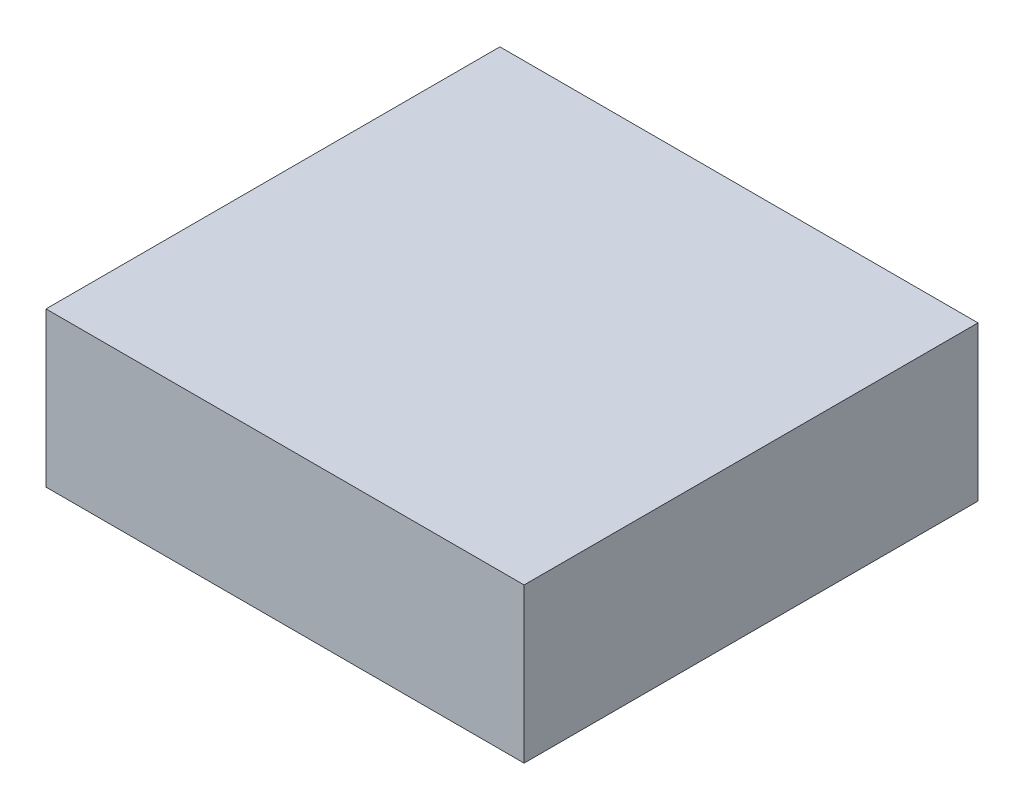
ISO-10303-21;
HEADER;
FILE_DESCRIPTION(('STEP AP214'),'2;1');
FILE_NAME('part.step','',(''),(''),'','','');
FILE_SCHEMA(('AUTOMOTIVE_DESIGN { 1 0 10303 214 1 1 1 1 }'));
ENDSEC;
DATA;
#1=APPLICATION_CONTEXT('core data for automotive mechanical design processes');
#2=APPLICATION_PROTOCOL_DEFINITION('international standard','automotive_design',2000,#1);
#3=PRODUCT_CONTEXT('',#1,'mechanical');
#4=PRODUCT('Part','Part','',(#3));
#5=PRODUCT_RELATED_PRODUCT_CATEGORY('part','',(#4));
#6=PRODUCT_DEFINITION_FORMATION('','',#4);
#7=PRODUCT_DEFINITION_CONTEXT('part definition',#1,'design');
#8=PRODUCT_DEFINITION('design','',#6,#7);
#9=PRODUCT_DEFINITION_SHAPE('','',#8);
#10=(LENGTH_UNIT() NAMED_UNIT(*) SI_UNIT(.MILLI.,.METRE.));
#11=(NAMED_UNIT(*) PLANE_ANGLE_UNIT() SI_UNIT($,.RADIAN.));
#12=(NAMED_UNIT(*) SI_UNIT($,.STERADIAN.) SOLID_ANGLE_UNIT());
#13=UNCERTAINTY_MEASURE_WITH_UNIT(LENGTH_MEASURE(1.E-05),#10,'distance_accuracy_value','');
#14=(GEOMETRIC_REPRESENTATION_CONTEXT(3) GLOBAL_UNCERTAINTY_ASSIGNED_CONTEXT((#13)) GLOBAL_UNIT_ASSIGNED_CONTEXT((#10,
#11,#12)) REPRESENTATION_CONTEXT('',''));
#15=CARTESIAN_POINT('',(0.,0.,0.));
#16=DIRECTION('',(0.,0.,1.));
#17=DIRECTION('',(1.,0.,0.));
#18=AXIS2_PLACEMENT_3D('',#15,#16,#17);
#19=CARTESIAN_POINT('',(50.,30.,50.));
#20=DIRECTION('',(-1.,0.,0.));
#21=DIRECTION('',(0.,0.,1.));
#22=AXIS2_PLACEMENT_3D('',#19,#20,#21);
#23=PLANE('',#22);
#24=DIRECTION('',(0.,0.,-1.));
#25=VECTOR('',#24,1.);
#26=CARTESIAN_POINT('',(50.,30.,50.));
#27=LINE('',#26,#25);
#28=CARTESIAN_POINT('',(50.,30.,38.220378054403));
#29=VERTEX_POINT('',#28);
#30=CARTESIAN_POINT('',(50.,30.,-50.));
#31=VERTEX_POINT('',#30);
#32=EDGE_CURVE('E116',#29,#31,#27,.T.);
#33=ORIENTED_EDGE('',*,*,#32,.F.);
#34=DIRECTION('',(0.,-1.,0.));
#35=VECTOR('',#34,1.);
#36=CARTESIAN_POINT('',(50.,30.,38.220378054403));
#37=LINE('',#36,#35);
#38=CARTESIAN_POINT('',(50.,0.,38.220378054403));
#39=VERTEX_POINT('',#38);
#40=EDGE_CURVE('E135',#29,#39,#37,.T.);
#41=ORIENTED_EDGE('',*,*,#40,.T.);
#42=DIRECTION('',(0.,0.,-1.));
#43=VECTOR('',#42,1.);
#44=CARTESIAN_POINT('',(50.,0.,50.));
#45=LINE('',#44,#43);
#46=CARTESIAN_POINT('',(50.,0.,-50.));
#47=VERTEX_POINT('',#46);
#48=EDGE_CURVE('E121',#39,#47,#45,.T.);
#49=ORIENTED_EDGE('',*,*,#48,.T.);
#50=DIRECTION('',(0.,-1.,0.));
#51=VECTOR('',#50,1.);
#52=CARTESIAN_POINT('',(50.,30.,-50.));
#53=LINE('',#52,#51);
#54=EDGE_CURVE('E11',#31,#47,#53,.T.);
#55=ORIENTED_EDGE('',*,*,#54,.F.);
#56=EDGE_LOOP('',(#33,#41,#49,#55));
#57=FACE_BOUND('',#56,.T.);
#58=ADVANCED_FACE('F35',(#57),#23,.F.);
#59=CARTESIAN_POINT('',(-50.,30.,-50.));
#60=DIRECTION('',(0.,0.,1.));
#61=DIRECTION('',(1.,0.,0.));
#62=AXIS2_PLACEMENT_3D('',#59,#60,#61);
#63=PLANE('',#62);
#64=DIRECTION('',(-1.,0.,0.));
#65=VECTOR('',#64,1.);
#66=CARTESIAN_POINT('',(-50.,0.,-50.));
#67=LINE('',#66,#65);
#68=CARTESIAN_POINT('',(-42.9247651028222,0.,-50.));
#69=VERTEX_POINT('',#68);
#70=EDGE_CURVE('E112',#47,#69,#67,.T.);
#71=ORIENTED_EDGE('',*,*,#70,.T.);
#72=DIRECTION('',(0.,-1.,0.));
#73=VECTOR('',#72,1.);
#74=CARTESIAN_POINT('',(-42.9247651028222,30.,-50.));
#75=LINE('',#74,#73);
#76=CARTESIAN_POINT('',(-42.9247651028222,30.,-50.));
#77=VERTEX_POINT('',#76);
#78=EDGE_CURVE('E100',#77,#69,#75,.T.);
#79=ORIENTED_EDGE('',*,*,#78,.F.);
#80=DIRECTION('',(-1.,0.,0.));
#81=VECTOR('',#80,1.);
#82=CARTESIAN_POINT('',(-50.,30.,-50.));
#83=LINE('',#82,#81);
#84=EDGE_CURVE('E42',#31,#77,#83,.T.);
#85=ORIENTED_EDGE('',*,*,#84,.F.);
#86=ORIENTED_EDGE('',*,*,#54,.T.);
#87=EDGE_LOOP('',(#71,#79,#85,#86));
#88=FACE_BOUND('',#87,.T.);
#89=ADVANCED_FACE('F109',(#88),#63,.F.);
#90=CARTESIAN_POINT('',(0.,30.,0.));
#91=DIRECTION('',(0.,-1.,0.));
#92=DIRECTION('',(0.,0.,-1.));
#93=AXIS2_PLACEMENT_3D('',#90,#91,#92);
#94=PLANE('',#93);
#95=ORIENTED_EDGE('',*,*,#84,.T.);
#96=DIRECTION('',(0.,0.,1.));
#97=VECTOR('',#96,1.);
#98=CARTESIAN_POINT('',(-42.9247651028222,30.,38.220378054403));
#99=LINE('',#98,#97);
#100=CARTESIAN_POINT('',(-42.9247651028222,30.,38.220378054403));
#101=VERTEX_POINT('',#100);
#102=EDGE_CURVE('E97',#77,#101,#99,.T.);
#103=ORIENTED_EDGE('',*,*,#102,.T.);
#104=DIRECTION('',(1.,0.,0.));
#105=VECTOR('',#104,1.);
#106=CARTESIAN_POINT('',(-50.,30.,38.220378054403));
#107=LINE('',#106,#105);
#108=EDGE_CURVE('E199',#101,#29,#107,.T.);
#109=ORIENTED_EDGE('',*,*,#108,.T.);
#110=ORIENTED_EDGE('',*,*,#32,.T.);
#111=EDGE_LOOP('',(#95,#103,#109,#110));
#112=FACE_BOUND('',#111,.T.);
#113=ADVANCED_FACE('F114',(#112),#94,.F.);
#114=CARTESIAN_POINT('',(0.,0.,0.));
#115=DIRECTION('',(0.,-1.,0.));
#116=DIRECTION('',(0.,0.,-1.));
#117=AXIS2_PLACEMENT_3D('',#114,#115,#116);
#118=PLANE('',#117);
#119=DIRECTION('',(0.,0.,1.));
#120=VECTOR('',#119,1.);
#121=CARTESIAN_POINT('',(-42.9247651028222,0.,38.220378054403));
#122=LINE('',#121,#120);
#123=CARTESIAN_POINT('',(-42.9247651028222,0.,38.220378054403));
#124=VERTEX_POINT('',#123);
#125=EDGE_CURVE('E49',#69,#124,#122,.T.);
#126=ORIENTED_EDGE('',*,*,#125,.F.);
#127=ORIENTED_EDGE('',*,*,#70,.F.);
#128=ORIENTED_EDGE('',*,*,#48,.F.);
#129=DIRECTION('',(1.,0.,0.));
#130=VECTOR('',#129,1.);
#131=CARTESIAN_POINT('',(-50.,0.,38.220378054403));
#132=LINE('',#131,#130);
#133=EDGE_CURVE('E203',#124,#39,#132,.T.);
#134=ORIENTED_EDGE('',*,*,#133,.F.);
#135=EDGE_LOOP('',(#126,#127,#128,#134));
#136=FACE_BOUND('',#135,.T.);
#137=CARTESIAN_POINT('',(0.,0.,0.));
#138=DIRECTION('',(0.,-1.,0.));
#139=DIRECTION('',(0.,0.,-1.));
#140=AXIS2_PLACEMENT_3D('',#137,#138,#139);
#141=CIRCLE('',#140,7.5);
#142=CARTESIAN_POINT('',(0.,0.,-7.5));
#143=VERTEX_POINT('',#142);
#144=EDGE_CURVE('E127',#143,#143,#141,.T.);
#145=ORIENTED_EDGE('',*,*,#144,.F.);
#146=EDGE_LOOP('',(#145));
#147=FACE_BOUND('',#146,.T.);
#148=CARTESIAN_POINT('',(-24.3436682864226,0.,-30.));
#149=DIRECTION('',(0.,-1.,0.));
#150=DIRECTION('',(0.,0.,-1.));
#151=AXIS2_PLACEMENT_3D('',#148,#149,#150);
#152=CIRCLE('',#151,7.5);
#153=CARTESIAN_POINT('',(-24.3436682864226,0.,-22.5));
#154=VERTEX_POINT('',#153);
#155=CARTESIAN_POINT('',(-24.3436682864226,0.,-37.5));
#156=VERTEX_POINT('',#155);
#157=EDGE_CURVE('E57',#154,#156,#152,.T.);
#158=ORIENTED_EDGE('',*,*,#157,.F.);
#159=DIRECTION('',(-1.,0.,0.));
#160=VECTOR('',#159,1.);
#161=CARTESIAN_POINT('',(-24.3436682864226,0.,-22.5));
#162=LINE('',#161,#160);
#163=CARTESIAN_POINT('',(25.6563317135774,0.,-22.5));
#164=VERTEX_POINT('',#163);
#165=EDGE_CURVE('E142',#164,#154,#162,.T.);
#166=ORIENTED_EDGE('',*,*,#165,.F.);
#167=CARTESIAN_POINT('',(25.6563317135774,0.,-30.));
#168=DIRECTION('',(0.,-1.,0.));
#169=DIRECTION('',(0.,0.,-1.));
#170=AXIS2_PLACEMENT_3D('',#167,#168,#169);
#171=CIRCLE('',#170,7.5);
#172=CARTESIAN_POINT('',(25.6563317135774,0.,-37.5));
#173=VERTEX_POINT('',#172);
#174=EDGE_CURVE('E156',#173,#164,#171,.T.);
#175=ORIENTED_EDGE('',*,*,#174,.F.);
#176=DIRECTION('',(1.,0.,0.));
#177=VECTOR('',#176,1.);
#178=CARTESIAN_POINT('',(-24.3436682864226,0.,-37.5));
#179=LINE('',#178,#177);
#180=EDGE_CURVE('E153',#156,#173,#179,.T.);
#181=ORIENTED_EDGE('',*,*,#180,.F.);
#182=EDGE_LOOP('',(#158,#166,#175,#181));
#183=FACE_BOUND('',#182,.T.);
#184=ADVANCED_FACE('F172',(#136,#147,#183),#118,.T.);
#185=CARTESIAN_POINT('',(-24.3436682864226,10.,-30.));
#186=DIRECTION('',(0.,-1.,0.));
#187=DIRECTION('',(0.,0.,-1.));
#188=AXIS2_PLACEMENT_3D('',#185,#186,#187);
#189=CYLINDRICAL_SURFACE('',#188,7.5);
#190=ORIENTED_EDGE('',*,*,#157,.T.);
#191=DIRECTION('',(0.,-1.,0.));
#192=VECTOR('',#191,1.);
#193=CARTESIAN_POINT('',(-24.3436682864226,10.,-37.5));
#194=LINE('',#193,#192);
#195=CARTESIAN_POINT('',(-24.3436682864226,10.,-37.5));
#196=VERTEX_POINT('',#195);
#197=EDGE_CURVE('E151',#196,#156,#194,.T.);
#198=ORIENTED_EDGE('',*,*,#197,.F.);
#199=CARTESIAN_POINT('',(-24.3436682864226,10.,-30.));
#200=DIRECTION('',(0.,-1.,0.));
#201=DIRECTION('',(0.,0.,-1.));
#202=AXIS2_PLACEMENT_3D('',#199,#200,#201);
#203=CIRCLE('',#202,7.5);
#204=CARTESIAN_POINT('',(-24.3436682864226,10.,-22.5));
#205=VERTEX_POINT('',#204);
#206=EDGE_CURVE('E138',#205,#196,#203,.T.);
#207=ORIENTED_EDGE('',*,*,#206,.F.);
#208=DIRECTION('',(0.,-1.,0.));
#209=VECTOR('',#208,1.);
#210=CARTESIAN_POINT('',(-24.3436682864226,10.,-22.5));
#211=LINE('',#210,#209);
#212=EDGE_CURVE('E132',#205,#154,#211,.T.);
#213=ORIENTED_EDGE('',*,*,#212,.T.);
#214=EDGE_LOOP('',(#190,#198,#207,#213));
#215=FACE_BOUND('',#214,.T.);
#216=ADVANCED_FACE('F180',(#215),#189,.F.);
#217=CARTESIAN_POINT('',(-24.3436682864226,10.,-22.5));
#218=DIRECTION('',(0.,0.,1.));
#219=DIRECTION('',(1.,0.,0.));
#220=AXIS2_PLACEMENT_3D('',#217,#218,#219);
#221=PLANE('',#220);
#222=ORIENTED_EDGE('',*,*,#165,.T.);
#223=ORIENTED_EDGE('',*,*,#212,.F.);
#224=DIRECTION('',(-1.,0.,0.));
#225=VECTOR('',#224,1.);
#226=CARTESIAN_POINT('',(-24.3436682864226,10.,-22.5));
#227=LINE('',#226,#225);
#228=CARTESIAN_POINT('',(25.6563317135774,10.,-22.5));
#229=VERTEX_POINT('',#228);
#230=EDGE_CURVE('E148',#229,#205,#227,.T.);
#231=ORIENTED_EDGE('',*,*,#230,.F.);
#232=DIRECTION('',(0.,-1.,0.));
#233=VECTOR('',#232,1.);
#234=CARTESIAN_POINT('',(25.6563317135774,10.,-22.5));
#235=LINE('',#234,#233);
#236=EDGE_CURVE('E162',#229,#164,#235,.T.);
#237=ORIENTED_EDGE('',*,*,#236,.T.);
#238=EDGE_LOOP('',(#222,#223,#231,#237));
#239=FACE_BOUND('',#238,.T.);
#240=ADVANCED_FACE('F182',(#239),#221,.F.);
#241=CARTESIAN_POINT('',(25.6563317135774,10.,-30.));
#242=DIRECTION('',(0.,-1.,0.));
#243=DIRECTION('',(0.,0.,-1.));
#244=AXIS2_PLACEMENT_3D('',#241,#242,#243);
#245=CYLINDRICAL_SURFACE('',#244,7.5);
#246=ORIENTED_EDGE('',*,*,#174,.T.);
#247=ORIENTED_EDGE('',*,*,#236,.F.);
#248=CARTESIAN_POINT('',(25.6563317135774,10.,-30.));
#249=DIRECTION('',(0.,-1.,0.));
#250=DIRECTION('',(0.,0.,-1.));
#251=AXIS2_PLACEMENT_3D('',#248,#249,#250);
#252=CIRCLE('',#251,7.5);
#253=CARTESIAN_POINT('',(25.6563317135774,10.,-37.5));
#254=VERTEX_POINT('',#253);
#255=EDGE_CURVE('E145',#254,#229,#252,.T.);
#256=ORIENTED_EDGE('',*,*,#255,.F.);
#257=DIRECTION('',(0.,-1.,0.));
#258=VECTOR('',#257,1.);
#259=CARTESIAN_POINT('',(25.6563317135774,10.,-37.5));
#260=LINE('',#259,#258);
#261=EDGE_CURVE('E164',#254,#173,#260,.T.);
#262=ORIENTED_EDGE('',*,*,#261,.T.);
#263=EDGE_LOOP('',(#246,#247,#256,#262));
#264=FACE_BOUND('',#263,.T.);
#265=ADVANCED_FACE('F175',(#264),#245,.F.);
#266=CARTESIAN_POINT('',(-24.3436682864226,10.,-37.5));
#267=DIRECTION('',(0.,0.,-1.));
#268=DIRECTION('',(-1.,0.,0.));
#269=AXIS2_PLACEMENT_3D('',#266,#267,#268);
#270=PLANE('',#269);
#271=ORIENTED_EDGE('',*,*,#180,.T.);
#272=ORIENTED_EDGE('',*,*,#261,.F.);
#273=DIRECTION('',(1.,0.,0.));
#274=VECTOR('',#273,1.);
#275=CARTESIAN_POINT('',(-24.3436682864226,10.,-37.5));
#276=LINE('',#275,#274);
#277=EDGE_CURVE('E141',#196,#254,#276,.T.);
#278=ORIENTED_EDGE('',*,*,#277,.F.);
#279=ORIENTED_EDGE('',*,*,#197,.T.);
#280=EDGE_LOOP('',(#271,#272,#278,#279));
#281=FACE_BOUND('',#280,.T.);
#282=ADVANCED_FACE('F168',(#281),#270,.F.);
#283=CARTESIAN_POINT('',(-24.3436682864226,10.,-30.));
#284=DIRECTION('',(0.,-1.,0.));
#285=DIRECTION('',(0.,0.,-1.));
#286=AXIS2_PLACEMENT_3D('',#283,#284,#285);
#287=PLANE('',#286);
#288=ORIENTED_EDGE('',*,*,#206,.T.);
#289=ORIENTED_EDGE('',*,*,#277,.T.);
#290=ORIENTED_EDGE('',*,*,#255,.T.);
#291=ORIENTED_EDGE('',*,*,#230,.T.);
#292=EDGE_LOOP('',(#288,#289,#290,#291));
#293=FACE_BOUND('',#292,.T.);
#294=ADVANCED_FACE('F179',(#293),#287,.T.);
#295=CARTESIAN_POINT('',(0.,10.,0.));
#296=DIRECTION('',(0.,-1.,0.));
#297=DIRECTION('',(0.,0.,-1.));
#298=AXIS2_PLACEMENT_3D('',#295,#296,#297);
#299=CYLINDRICAL_SURFACE('',#298,7.5);
#300=CARTESIAN_POINT('',(0.,10.,0.));
#301=DIRECTION('',(0.,-1.,0.));
#302=DIRECTION('',(0.,0.,-1.));
#303=AXIS2_PLACEMENT_3D('',#300,#301,#302);
#304=CIRCLE('',#303,7.5);
#305=CARTESIAN_POINT('',(0.,10.,-7.5));
#306=VERTEX_POINT('',#305);
#307=EDGE_CURVE('E122',#306,#306,#304,.T.);
#308=ORIENTED_EDGE('',*,*,#307,.F.);
#309=EDGE_LOOP('',(#308));
#310=FACE_BOUND('',#309,.T.);
#311=ORIENTED_EDGE('',*,*,#144,.T.);
#312=EDGE_LOOP('',(#311));
#313=FACE_BOUND('',#312,.T.);
#314=ADVANCED_FACE('F216',(#310,#313),#299,.F.);
#315=CARTESIAN_POINT('',(0.,10.,0.));
#316=DIRECTION('',(0.,-1.,0.));
#317=DIRECTION('',(0.,0.,-1.));
#318=AXIS2_PLACEMENT_3D('',#315,#316,#317);
#319=PLANE('',#318);
#320=ORIENTED_EDGE('',*,*,#307,.T.);
#321=EDGE_LOOP('',(#320));
#322=FACE_BOUND('',#321,.T.);
#323=ADVANCED_FACE('F209',(#322),#319,.T.);
#324=CARTESIAN_POINT('',(-50.,30.,38.220378054403));
#325=DIRECTION('',(0.,0.,-1.));
#326=DIRECTION('',(-1.,0.,0.));
#327=AXIS2_PLACEMENT_3D('',#324,#325,#326);
#328=PLANE('',#327);
#329=ORIENTED_EDGE('',*,*,#108,.F.);
#330=DIRECTION('',(0.,-1.,0.));
#331=VECTOR('',#330,1.);
#332=CARTESIAN_POINT('',(-42.9247651028222,30.,38.220378054403));
#333=LINE('',#332,#331);
#334=EDGE_CURVE('E101',#101,#124,#333,.T.);
#335=ORIENTED_EDGE('',*,*,#334,.T.);
#336=ORIENTED_EDGE('',*,*,#133,.T.);
#337=ORIENTED_EDGE('',*,*,#40,.F.);
#338=EDGE_LOOP('',(#329,#335,#336,#337));
#339=FACE_BOUND('',#338,.T.);
#340=ADVANCED_FACE('F207',(#339),#328,.F.);
#341=CARTESIAN_POINT('',(-42.9247651028222,30.,38.220378054403));
#342=DIRECTION('',(1.,0.,0.));
#343=DIRECTION('',(0.,0.,-1.));
#344=AXIS2_PLACEMENT_3D('',#341,#342,#343);
#345=PLANE('',#344);
#346=ORIENTED_EDGE('',*,*,#125,.T.);
#347=ORIENTED_EDGE('',*,*,#334,.F.);
#348=ORIENTED_EDGE('',*,*,#102,.F.);
#349=ORIENTED_EDGE('',*,*,#78,.T.);
#350=EDGE_LOOP('',(#346,#347,#348,#349));
#351=FACE_BOUND('',#350,.T.);
#352=ADVANCED_FACE('F99',(#351),#345,.F.);
#353=CLOSED_SHELL('',(#58,#89,#113,#184,#216,#240,#265,#282,#294,#314,#323,#340,#352));
#354=MANIFOLD_SOLID_BREP('B2',#353);
#355=ADVANCED_BREP_SHAPE_REPRESENTATION('',(#18,#354),#14);
#356=SHAPE_DEFINITION_REPRESENTATION(#9,#355);
ENDSEC;
END-ISO-10303-21;
